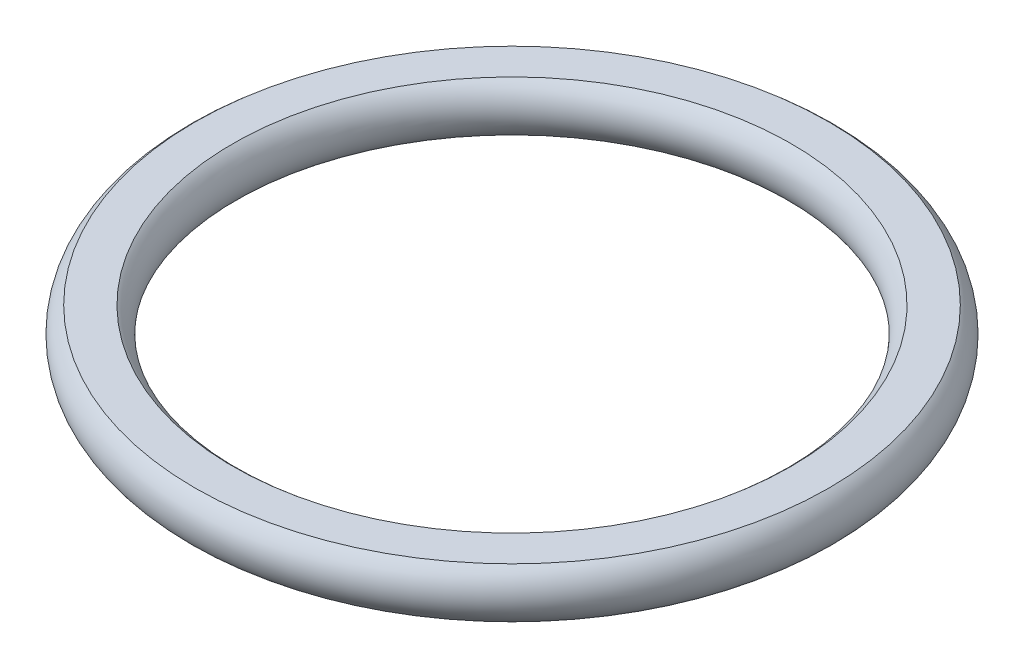
ISO-10303-21;
HEADER;
FILE_DESCRIPTION(('STEP AP214'),'2;1');
FILE_NAME('part.step','',(''),(''),'','','');
FILE_SCHEMA(('AUTOMOTIVE_DESIGN { 1 0 10303 214 1 1 1 1 }'));
ENDSEC;
DATA;
#1=APPLICATION_CONTEXT('core data for automotive mechanical design processes');
#2=APPLICATION_PROTOCOL_DEFINITION('international standard','automotive_design',2000,#1);
#3=PRODUCT_CONTEXT('',#1,'mechanical');
#4=PRODUCT('Part','Part','',(#3));
#5=PRODUCT_RELATED_PRODUCT_CATEGORY('part','',(#4));
#6=PRODUCT_DEFINITION_FORMATION('','',#4);
#7=PRODUCT_DEFINITION_CONTEXT('part definition',#1,'design');
#8=PRODUCT_DEFINITION('design','',#6,#7);
#9=PRODUCT_DEFINITION_SHAPE('','',#8);
#10=(LENGTH_UNIT() NAMED_UNIT(*) SI_UNIT(.MILLI.,.METRE.));
#11=(NAMED_UNIT(*) PLANE_ANGLE_UNIT() SI_UNIT($,.RADIAN.));
#12=(NAMED_UNIT(*) SI_UNIT($,.STERADIAN.) SOLID_ANGLE_UNIT());
#13=UNCERTAINTY_MEASURE_WITH_UNIT(LENGTH_MEASURE(1.E-05),#10,'distance_accuracy_value','');
#14=(GEOMETRIC_REPRESENTATION_CONTEXT(3) GLOBAL_UNCERTAINTY_ASSIGNED_CONTEXT((#13)) GLOBAL_UNIT_ASSIGNED_CONTEXT((#10,
#11,#12)) REPRESENTATION_CONTEXT('',''));
#15=CARTESIAN_POINT('',(0.,0.,0.));
#16=DIRECTION('',(0.,0.,1.));
#17=DIRECTION('',(1.,0.,0.));
#18=AXIS2_PLACEMENT_3D('',#15,#16,#17);
#19=CARTESIAN_POINT('',(23.75,-2.,0.));
#20=DIRECTION('',(0.,-1.,0.));
#21=DIRECTION('',(0.,0.,-1.));
#22=AXIS2_PLACEMENT_3D('',#19,#20,#21);
#23=PLANE('',#22);
#24=CARTESIAN_POINT('',(23.75,-2.,0.));
#25=DIRECTION('',(0.,-1.,0.));
#26=DIRECTION('',(-1.,0.,0.));
#27=AXIS2_PLACEMENT_3D('',#24,#25,#26);
#28=CIRCLE('',#27,22.25);
#29=CARTESIAN_POINT('',(46.,-2.,0.));
#30=VERTEX_POINT('',#29);
#31=EDGE_CURVE('E11',#30,#30,#28,.T.);
#32=ORIENTED_EDGE('',*,*,#31,.F.);
#33=EDGE_LOOP('',(#32));
#34=FACE_BOUND('',#33,.T.);
#35=CARTESIAN_POINT('',(23.75,-2.,0.));
#36=DIRECTION('',(0.,1.,0.));
#37=DIRECTION('',(-1.,0.,0.));
#38=AXIS2_PLACEMENT_3D('',#35,#36,#37);
#39=CIRCLE('',#38,25.25);
#40=CARTESIAN_POINT('',(49.,-2.,0.));
#41=VERTEX_POINT('',#40);
#42=EDGE_CURVE('E21',#41,#41,#39,.T.);
#43=ORIENTED_EDGE('',*,*,#42,.F.);
#44=EDGE_LOOP('',(#43));
#45=FACE_BOUND('',#44,.T.);
#46=ADVANCED_FACE('F17',(#34,#45),#23,.T.);
#47=CARTESIAN_POINT('',(23.75,0.,0.));
#48=DIRECTION('',(0.,-1.,0.));
#49=DIRECTION('',(-1.,0.,0.));
#50=AXIS2_PLACEMENT_3D('',#47,#48,#49);
#51=TOROIDAL_SURFACE('',#50,23.75,2.5);
#52=CARTESIAN_POINT('',(23.75,2.,0.));
#53=DIRECTION('',(0.,-1.,0.));
#54=DIRECTION('',(-1.,0.,0.));
#55=AXIS2_PLACEMENT_3D('',#52,#53,#54);
#56=CIRCLE('',#55,22.25);
#57=CARTESIAN_POINT('',(46.,2.,0.));
#58=VERTEX_POINT('',#57);
#59=EDGE_CURVE('E65',#58,#58,#56,.T.);
#60=ORIENTED_EDGE('',*,*,#59,.F.);
#61=CARTESIAN_POINT('',(47.5,0.,0.));
#62=DIRECTION('',(0.,0.,1.));
#63=DIRECTION('',(1.,0.,0.));
#64=AXIS2_PLACEMENT_3D('',#61,#62,#63);
#65=CIRCLE('',#64,2.5);
#66=EDGE_CURVE('E27',#58,#30,#65,.T.);
#67=ORIENTED_EDGE('',*,*,#66,.T.);
#68=ORIENTED_EDGE('',*,*,#31,.T.);
#69=ORIENTED_EDGE('',*,*,#66,.F.);
#70=EDGE_LOOP('',(#60,#67,#68,#69));
#71=FACE_BOUND('',#70,.T.);
#72=ADVANCED_FACE('F73',(#71),#51,.T.);
#73=CARTESIAN_POINT('',(23.75,2.,0.));
#74=DIRECTION('',(0.,-1.,0.));
#75=DIRECTION('',(0.,0.,-1.));
#76=AXIS2_PLACEMENT_3D('',#73,#74,#75);
#77=PLANE('',#76);
#78=ORIENTED_EDGE('',*,*,#59,.T.);
#79=EDGE_LOOP('',(#78));
#80=FACE_BOUND('',#79,.T.);
#81=CARTESIAN_POINT('',(23.75,2.,0.));
#82=DIRECTION('',(0.,-1.,0.));
#83=DIRECTION('',(-1.,0.,0.));
#84=AXIS2_PLACEMENT_3D('',#81,#82,#83);
#85=CIRCLE('',#84,25.25);
#86=CARTESIAN_POINT('',(49.,2.,0.));
#87=VERTEX_POINT('',#86);
#88=EDGE_CURVE('E58',#87,#87,#85,.T.);
#89=ORIENTED_EDGE('',*,*,#88,.F.);
#90=EDGE_LOOP('',(#89));
#91=FACE_BOUND('',#90,.T.);
#92=ADVANCED_FACE('F75',(#80,#91),#77,.F.);
#93=CARTESIAN_POINT('',(23.75,0.,0.));
#94=DIRECTION('',(0.,-1.,0.));
#95=DIRECTION('',(-1.,0.,0.));
#96=AXIS2_PLACEMENT_3D('',#93,#94,#95);
#97=TOROIDAL_SURFACE('',#96,23.75,2.5);
#98=ORIENTED_EDGE('',*,*,#42,.T.);
#99=CARTESIAN_POINT('',(47.5,0.,0.));
#100=DIRECTION('',(0.,0.,1.));
#101=DIRECTION('',(1.,0.,0.));
#102=AXIS2_PLACEMENT_3D('',#99,#100,#101);
#103=CIRCLE('',#102,2.5);
#104=EDGE_CURVE('E55',#41,#87,#103,.T.);
#105=ORIENTED_EDGE('',*,*,#104,.T.);
#106=ORIENTED_EDGE('',*,*,#88,.T.);
#107=ORIENTED_EDGE('',*,*,#104,.F.);
#108=EDGE_LOOP('',(#98,#105,#106,#107));
#109=FACE_BOUND('',#108,.T.);
#110=ADVANCED_FACE('F19',(#109),#97,.T.);
#111=CLOSED_SHELL('',(#46,#72,#92,#110));
#112=MANIFOLD_SOLID_BREP('B1',#111);
#113=ADVANCED_BREP_SHAPE_REPRESENTATION('',(#18,#112),#14);
#114=SHAPE_DEFINITION_REPRESENTATION(#9,#113);
ENDSEC;
END-ISO-10303-21;
